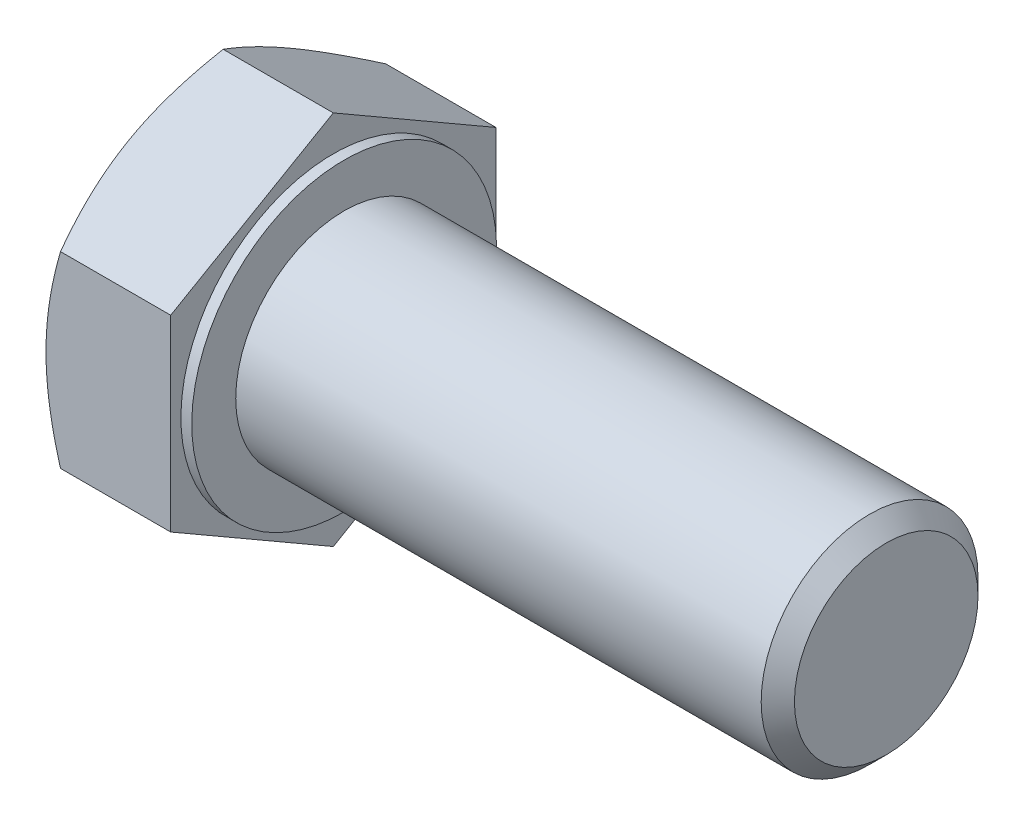
ISO-10303-21;
HEADER;
FILE_DESCRIPTION(('STEP AP214'),'2;1');
FILE_NAME('part.step','',(''),(''),'','','');
FILE_SCHEMA(('AUTOMOTIVE_DESIGN { 1 0 10303 214 1 1 1 1 }'));
ENDSEC;
DATA;
#1=APPLICATION_CONTEXT('core data for automotive mechanical design processes');
#2=APPLICATION_PROTOCOL_DEFINITION('international standard','automotive_design',2000,#1);
#3=PRODUCT_CONTEXT('',#1,'mechanical');
#4=PRODUCT('Part','Part','',(#3));
#5=PRODUCT_RELATED_PRODUCT_CATEGORY('part','',(#4));
#6=PRODUCT_DEFINITION_FORMATION('','',#4);
#7=PRODUCT_DEFINITION_CONTEXT('part definition',#1,'design');
#8=PRODUCT_DEFINITION('design','',#6,#7);
#9=PRODUCT_DEFINITION_SHAPE('','',#8);
#10=(LENGTH_UNIT() NAMED_UNIT(*) SI_UNIT(.MILLI.,.METRE.));
#11=(NAMED_UNIT(*) PLANE_ANGLE_UNIT() SI_UNIT($,.RADIAN.));
#12=(NAMED_UNIT(*) SI_UNIT($,.STERADIAN.) SOLID_ANGLE_UNIT());
#13=UNCERTAINTY_MEASURE_WITH_UNIT(LENGTH_MEASURE(1.E-05),#10,'distance_accuracy_value','');
#14=(GEOMETRIC_REPRESENTATION_CONTEXT(3) GLOBAL_UNCERTAINTY_ASSIGNED_CONTEXT((#13)) GLOBAL_UNIT_ASSIGNED_CONTEXT((#10,
#11,#12)) REPRESENTATION_CONTEXT('',''));
#15=CARTESIAN_POINT('',(0.,0.,0.));
#16=DIRECTION('',(0.,0.,1.));
#17=DIRECTION('',(1.,0.,0.));
#18=AXIS2_PLACEMENT_3D('',#15,#16,#17);
#19=CARTESIAN_POINT('',(0.,9.6225,0.));
#20=DIRECTION('',(1.,0.,0.));
#21=DIRECTION('',(0.,1.,0.));
#22=AXIS2_PLACEMENT_3D('',#19,#20,#21);
#23=PLANE('',#22);
#24=CARTESIAN_POINT('',(0.,0.,0.));
#25=DIRECTION('',(1.,0.,0.));
#26=DIRECTION('',(0.,1.,0.));
#27=AXIS2_PLACEMENT_3D('',#24,#25,#26);
#28=CIRCLE('',#27,8.);
#29=CARTESIAN_POINT('',(0.,-8.,0.));
#30=VERTEX_POINT('',#29);
#31=EDGE_CURVE('E190',#30,#30,#28,.T.);
#32=ORIENTED_EDGE('',*,*,#31,.F.);
#33=EDGE_LOOP('',(#32));
#34=FACE_BOUND('',#33,.T.);
#35=CARTESIAN_POINT('',(0.,0.,0.));
#36=DIRECTION('',(1.,0.,0.));
#37=DIRECTION('',(0.,1.,0.));
#38=AXIS2_PLACEMENT_3D('',#35,#36,#37);
#39=CIRCLE('',#38,11.245);
#40=CARTESIAN_POINT('',(0.,-11.245,0.));
#41=VERTEX_POINT('',#40);
#42=EDGE_CURVE('E21',#41,#41,#39,.T.);
#43=ORIENTED_EDGE('',*,*,#42,.T.);
#44=EDGE_LOOP('',(#43));
#45=FACE_BOUND('',#44,.T.);
#46=ADVANCED_FACE('F17',(#34,#45),#23,.T.);
#47=CARTESIAN_POINT('',(-0.40005,0.,0.));
#48=DIRECTION('',(1.,0.,0.));
#49=DIRECTION('',(0.,1.,0.));
#50=AXIS2_PLACEMENT_3D('',#47,#48,#49);
#51=CYLINDRICAL_SURFACE('',#50,11.245);
#52=ORIENTED_EDGE('',*,*,#42,.F.);
#53=DIRECTION('',(-1.,0.,0.));
#54=VECTOR('',#53,1.);
#55=CARTESIAN_POINT('',(-0.40005,-11.245,0.));
#56=LINE('',#55,#54);
#57=CARTESIAN_POINT('',(-0.8001,-11.245,0.));
#58=VERTEX_POINT('',#57);
#59=EDGE_CURVE('E11',#41,#58,#56,.T.);
#60=ORIENTED_EDGE('',*,*,#59,.T.);
#61=CARTESIAN_POINT('',(-0.8001,0.,0.));
#62=DIRECTION('',(1.,0.,0.));
#63=DIRECTION('',(0.,1.,0.));
#64=AXIS2_PLACEMENT_3D('',#61,#62,#63);
#65=CIRCLE('',#64,11.245);
#66=EDGE_CURVE('E336',#58,#58,#65,.T.);
#67=ORIENTED_EDGE('',*,*,#66,.T.);
#68=ORIENTED_EDGE('',*,*,#59,.F.);
#69=EDGE_LOOP('',(#52,#60,#67,#68));
#70=FACE_BOUND('',#69,.T.);
#71=ADVANCED_FACE('F360',(#70),#51,.T.);
#72=CARTESIAN_POINT('',(-10.0001,0.,0.));
#73=DIRECTION('',(1.,0.,0.));
#74=DIRECTION('',(0.,1.,0.));
#75=AXIS2_PLACEMENT_3D('',#72,#73,#74);
#76=PLANE('',#75);
#77=CARTESIAN_POINT('',(-10.0001,0.,0.));
#78=DIRECTION('',(-1.,0.,0.));
#79=DIRECTION('',(0.,1.,0.));
#80=AXIS2_PLACEMENT_3D('',#77,#78,#79);
#81=CIRCLE('',#80,12.);
#82=CARTESIAN_POINT('',(-10.0001,0.,12.));
#83=VERTEX_POINT('',#82);
#84=CARTESIAN_POINT('',(-10.0001,10.3923048454133,6.));
#85=VERTEX_POINT('',#84);
#86=EDGE_CURVE('E176',#83,#85,#81,.T.);
#87=ORIENTED_EDGE('',*,*,#86,.T.);
#88=CARTESIAN_POINT('',(-10.0001,0.,0.));
#89=DIRECTION('',(-1.,0.,0.));
#90=DIRECTION('',(0.,1.,0.));
#91=AXIS2_PLACEMENT_3D('',#88,#89,#90);
#92=CIRCLE('',#91,12.);
#93=CARTESIAN_POINT('',(-10.0001,10.3923048454133,-6.));
#94=VERTEX_POINT('',#93);
#95=EDGE_CURVE('E165',#85,#94,#92,.T.);
#96=ORIENTED_EDGE('',*,*,#95,.T.);
#97=CARTESIAN_POINT('',(-10.0001,0.,0.));
#98=DIRECTION('',(-1.,0.,0.));
#99=DIRECTION('',(0.,1.,0.));
#100=AXIS2_PLACEMENT_3D('',#97,#98,#99);
#101=CIRCLE('',#100,12.);
#102=CARTESIAN_POINT('',(-10.0001,0.,-12.));
#103=VERTEX_POINT('',#102);
#104=EDGE_CURVE('E262',#94,#103,#101,.T.);
#105=ORIENTED_EDGE('',*,*,#104,.T.);
#106=CARTESIAN_POINT('',(-10.0001,0.,0.));
#107=DIRECTION('',(-1.,0.,0.));
#108=DIRECTION('',(0.,1.,0.));
#109=AXIS2_PLACEMENT_3D('',#106,#107,#108);
#110=CIRCLE('',#109,12.);
#111=CARTESIAN_POINT('',(-10.0001,-10.3923048454133,-6.));
#112=VERTEX_POINT('',#111);
#113=EDGE_CURVE('E226',#103,#112,#110,.T.);
#114=ORIENTED_EDGE('',*,*,#113,.T.);
#115=CARTESIAN_POINT('',(-10.0001,0.,0.));
#116=DIRECTION('',(-1.,0.,0.));
#117=DIRECTION('',(0.,1.,0.));
#118=AXIS2_PLACEMENT_3D('',#115,#116,#117);
#119=CIRCLE('',#118,12.);
#120=CARTESIAN_POINT('',(-10.0001,-10.3923048454133,6.));
#121=VERTEX_POINT('',#120);
#122=EDGE_CURVE('E218',#112,#121,#119,.T.);
#123=ORIENTED_EDGE('',*,*,#122,.T.);
#124=CARTESIAN_POINT('',(-10.0001,0.,0.));
#125=DIRECTION('',(-1.,0.,0.));
#126=DIRECTION('',(0.,1.,0.));
#127=AXIS2_PLACEMENT_3D('',#124,#125,#126);
#128=CIRCLE('',#127,12.);
#129=EDGE_CURVE('E180',#121,#83,#128,.T.);
#130=ORIENTED_EDGE('',*,*,#129,.T.);
#131=EDGE_LOOP('',(#87,#96,#105,#114,#123,#130));
#132=FACE_BOUND('',#131,.T.);
#133=ADVANCED_FACE('F177',(#132),#76,.F.);
#134=CARTESIAN_POINT('',(-0.8001,-13.856406460551,0.));
#135=DIRECTION('',(0.,-0.866025403784439,-0.5));
#136=DIRECTION('',(0.,0.5,-0.866025403784439));
#137=AXIS2_PLACEMENT_3D('',#134,#135,#136);
#138=PLANE('',#137);
#139=CARTESIAN_POINT('',(-10.0001,-10.3923048454133,-6.));
#140=CARTESIAN_POINT('',(-10.0001,-8.78460969082654,-8.78460969082651));
#141=CARTESIAN_POINT('',(-8.92830323027553,-6.92820323027552,-12.));
#142=(BOUNDED_CURVE() B_SPLINE_CURVE(2,(#139,#140,#141),.UNSPECIFIED.,.F.,
.F.) B_SPLINE_CURVE_WITH_KNOTS((3,3),(0.702851662530288,1.40570332506058),
.UNSPECIFIED.) CURVE() GEOMETRIC_REPRESENTATION_ITEM() RATIONAL_B_SPLINE_CURVE((1.,
1.03795484930205,1.)) REPRESENTATION_ITEM(''));
#143=CARTESIAN_POINT('',(-8.92830323027553,-6.92820323027552,-12.));
#144=VERTEX_POINT('',#143);
#145=EDGE_CURVE('E229',#112,#144,#142,.T.);
#146=ORIENTED_EDGE('',*,*,#145,.T.);
#147=DIRECTION('',(-1.,0.,0.));
#148=VECTOR('',#147,1.);
#149=CARTESIAN_POINT('',(-0.8001,-6.9282032302755,-12.));
#150=LINE('',#149,#148);
#151=CARTESIAN_POINT('',(-0.8001,-6.9282032302755,-12.));
#152=VERTEX_POINT('',#151);
#153=EDGE_CURVE('E91',#152,#144,#150,.T.);
#154=ORIENTED_EDGE('',*,*,#153,.F.);
#155=DIRECTION('',(0.,0.5,-0.866025403784439));
#156=VECTOR('',#155,1.);
#157=CARTESIAN_POINT('',(-0.8001,-13.856406460551,0.));
#158=LINE('',#157,#156);
#159=CARTESIAN_POINT('',(-0.8001,-13.856406460551,0.));
#160=VERTEX_POINT('',#159);
#161=EDGE_CURVE('E134',#160,#152,#158,.T.);
#162=ORIENTED_EDGE('',*,*,#161,.F.);
#163=DIRECTION('',(-1.,0.,0.));
#164=VECTOR('',#163,1.);
#165=CARTESIAN_POINT('',(-0.8001,-13.856406460551,0.));
#166=LINE('',#165,#164);
#167=CARTESIAN_POINT('',(-8.92830323027553,-13.856406460551,0.));
#168=VERTEX_POINT('',#167);
#169=EDGE_CURVE('E201',#160,#168,#166,.T.);
#170=ORIENTED_EDGE('',*,*,#169,.T.);
#171=CARTESIAN_POINT('',(-8.92830323027554,-13.856406460551,0.));
#172=CARTESIAN_POINT('',(-10.0001,-12.,-3.21539030917348));
#173=CARTESIAN_POINT('',(-10.0001,-10.3923048454133,-6.));
#174=(BOUNDED_CURVE() B_SPLINE_CURVE(2,(#171,#172,#173),.UNSPECIFIED.,.F.,
.F.) B_SPLINE_CURVE_WITH_KNOTS((3,3),(0.,0.702851662530288),
.UNSPECIFIED.) CURVE() GEOMETRIC_REPRESENTATION_ITEM() RATIONAL_B_SPLINE_CURVE((1.,
1.03795484930205,1.)) REPRESENTATION_ITEM(''));
#175=EDGE_CURVE('E164',#168,#112,#174,.T.);
#176=ORIENTED_EDGE('',*,*,#175,.T.);
#177=EDGE_LOOP('',(#146,#154,#162,#170,#176));
#178=FACE_BOUND('',#177,.T.);
#179=ADVANCED_FACE('F392',(#178),#138,.T.);
#180=CARTESIAN_POINT('',(-0.8001,-6.92820323027551,12.));
#181=DIRECTION('',(0.,-0.866025403784439,0.5));
#182=DIRECTION('',(-1.,0.,0.));
#183=AXIS2_PLACEMENT_3D('',#180,#181,#182);
#184=PLANE('',#183);
#185=CARTESIAN_POINT('',(-10.0001,-10.3923048454133,6.));
#186=CARTESIAN_POINT('',(-10.0001,-12.,3.21539030917348));
#187=CARTESIAN_POINT('',(-8.92830323027553,-13.856406460551,0.));
#188=(BOUNDED_CURVE() B_SPLINE_CURVE(2,(#185,#186,#187),.UNSPECIFIED.,.F.,
.F.) B_SPLINE_CURVE_WITH_KNOTS((3,3),(0.702851662530287,1.40570332506057),
.UNSPECIFIED.) CURVE() GEOMETRIC_REPRESENTATION_ITEM() RATIONAL_B_SPLINE_CURVE((1.,
1.03795484930206,1.)) REPRESENTATION_ITEM(''));
#189=EDGE_CURVE('E225',#121,#168,#188,.T.);
#190=ORIENTED_EDGE('',*,*,#189,.T.);
#191=ORIENTED_EDGE('',*,*,#169,.F.);
#192=DIRECTION('',(0.,-0.5,-0.866025403784439));
#193=VECTOR('',#192,1.);
#194=CARTESIAN_POINT('',(-0.8001,-6.92820323027551,12.));
#195=LINE('',#194,#193);
#196=CARTESIAN_POINT('',(-0.8001,-6.92820323027551,12.));
#197=VERTEX_POINT('',#196);
#198=EDGE_CURVE('E322',#197,#160,#195,.T.);
#199=ORIENTED_EDGE('',*,*,#198,.F.);
#200=DIRECTION('',(-1.,0.,0.));
#201=VECTOR('',#200,1.);
#202=CARTESIAN_POINT('',(-0.8001,-6.92820323027551,12.));
#203=LINE('',#202,#201);
#204=CARTESIAN_POINT('',(-8.92830323027553,-6.92820323027548,12.));
#205=VERTEX_POINT('',#204);
#206=EDGE_CURVE('E333',#197,#205,#203,.T.);
#207=ORIENTED_EDGE('',*,*,#206,.T.);
#208=CARTESIAN_POINT('',(-8.92830323027553,-6.92820323027554,12.));
#209=CARTESIAN_POINT('',(-10.0001,-8.78460969082653,8.78460969082652));
#210=CARTESIAN_POINT('',(-10.0001,-10.3923048454133,6.));
#211=(BOUNDED_CURVE() B_SPLINE_CURVE(2,(#208,#209,#210),.UNSPECIFIED.,.F.,
.F.) B_SPLINE_CURVE_WITH_KNOTS((3,3),(0.,0.702851662530287),
.UNSPECIFIED.) CURVE() GEOMETRIC_REPRESENTATION_ITEM() RATIONAL_B_SPLINE_CURVE((1.,
1.03795484930205,1.)) REPRESENTATION_ITEM(''));
#212=EDGE_CURVE('E217',#205,#121,#211,.T.);
#213=ORIENTED_EDGE('',*,*,#212,.T.);
#214=EDGE_LOOP('',(#190,#191,#199,#207,#213));
#215=FACE_BOUND('',#214,.T.);
#216=ADVANCED_FACE('F388',(#215),#184,.T.);
#217=CARTESIAN_POINT('',(-0.8001,6.9282032302755,12.));
#218=DIRECTION('',(0.,0.,1.));
#219=DIRECTION('',(1.,0.,0.));
#220=AXIS2_PLACEMENT_3D('',#217,#218,#219);
#221=PLANE('',#220);
#222=CARTESIAN_POINT('',(-10.0001,0.,12.));
#223=CARTESIAN_POINT('',(-10.0001,-3.21539030917347,12.));
#224=CARTESIAN_POINT('',(-8.92830323027553,-6.92820323027548,12.));
#225=(BOUNDED_CURVE() B_SPLINE_CURVE(2,(#222,#223,#224),.UNSPECIFIED.,.F.,
.F.) B_SPLINE_CURVE_WITH_KNOTS((3,3),(0.702851662530288,1.40570332506058),
.UNSPECIFIED.) CURVE() GEOMETRIC_REPRESENTATION_ITEM() RATIONAL_B_SPLINE_CURVE((1.,
1.03795484930205,1.)) REPRESENTATION_ITEM(''));
#226=EDGE_CURVE('E232',#83,#205,#225,.T.);
#227=ORIENTED_EDGE('',*,*,#226,.T.);
#228=ORIENTED_EDGE('',*,*,#206,.F.);
#229=DIRECTION('',(0.,-1.,0.));
#230=VECTOR('',#229,1.);
#231=CARTESIAN_POINT('',(-0.8001,6.9282032302755,12.));
#232=LINE('',#231,#230);
#233=CARTESIAN_POINT('',(-0.8001,6.9282032302755,12.));
#234=VERTEX_POINT('',#233);
#235=EDGE_CURVE('E307',#234,#197,#232,.T.);
#236=ORIENTED_EDGE('',*,*,#235,.F.);
#237=DIRECTION('',(-1.,0.,0.));
#238=VECTOR('',#237,1.);
#239=CARTESIAN_POINT('',(-0.8001,6.9282032302755,12.));
#240=LINE('',#239,#238);
#241=CARTESIAN_POINT('',(-8.92830323027553,6.92820323027546,12.));
#242=VERTEX_POINT('',#241);
#243=EDGE_CURVE('E304',#234,#242,#240,.T.);
#244=ORIENTED_EDGE('',*,*,#243,.T.);
#245=CARTESIAN_POINT('',(-8.92830323027554,6.92820323027546,12.));
#246=CARTESIAN_POINT('',(-10.0001,3.21539030917344,12.));
#247=CARTESIAN_POINT('',(-10.0001,0.,12.));
#248=(BOUNDED_CURVE() B_SPLINE_CURVE(2,(#245,#246,#247),.UNSPECIFIED.,.F.,
.F.) B_SPLINE_CURVE_WITH_KNOTS((3,3),(0.,0.702851662530288),
.UNSPECIFIED.) CURVE() GEOMETRIC_REPRESENTATION_ITEM() RATIONAL_B_SPLINE_CURVE((1.,
1.03795484930203,1.)) REPRESENTATION_ITEM(''));
#249=EDGE_CURVE('E185',#242,#83,#248,.T.);
#250=ORIENTED_EDGE('',*,*,#249,.T.);
#251=EDGE_LOOP('',(#227,#228,#236,#244,#250));
#252=FACE_BOUND('',#251,.T.);
#253=ADVANCED_FACE('F385',(#252),#221,.T.);
#254=CARTESIAN_POINT('',(-0.8001,0.,0.));
#255=DIRECTION('',(1.,0.,0.));
#256=DIRECTION('',(0.,1.,0.));
#257=AXIS2_PLACEMENT_3D('',#254,#255,#256);
#258=PLANE('',#257);
#259=ORIENTED_EDGE('',*,*,#66,.F.);
#260=EDGE_LOOP('',(#259));
#261=FACE_BOUND('',#260,.T.);
#262=DIRECTION('',(0.,-0.5,0.866025403784438));
#263=VECTOR('',#262,1.);
#264=CARTESIAN_POINT('',(-0.8001,13.856406460551,0.));
#265=LINE('',#264,#263);
#266=CARTESIAN_POINT('',(-0.8001,13.856406460551,0.));
#267=VERTEX_POINT('',#266);
#268=EDGE_CURVE('E124',#267,#234,#265,.T.);
#269=ORIENTED_EDGE('',*,*,#268,.T.);
#270=ORIENTED_EDGE('',*,*,#235,.T.);
#271=ORIENTED_EDGE('',*,*,#198,.T.);
#272=ORIENTED_EDGE('',*,*,#161,.T.);
#273=DIRECTION('',(0.,1.,0.));
#274=VECTOR('',#273,1.);
#275=CARTESIAN_POINT('',(-0.8001,-6.9282032302755,-12.));
#276=LINE('',#275,#274);
#277=CARTESIAN_POINT('',(-0.8001,6.92820323027551,-12.));
#278=VERTEX_POINT('',#277);
#279=EDGE_CURVE('E263',#152,#278,#276,.T.);
#280=ORIENTED_EDGE('',*,*,#279,.T.);
#281=DIRECTION('',(0.,0.5,0.866025403784439));
#282=VECTOR('',#281,1.);
#283=CARTESIAN_POINT('',(-0.8001,6.92820323027551,-12.));
#284=LINE('',#283,#282);
#285=EDGE_CURVE('E293',#278,#267,#284,.T.);
#286=ORIENTED_EDGE('',*,*,#285,.T.);
#287=EDGE_LOOP('',(#269,#270,#271,#272,#280,#286));
#288=FACE_BOUND('',#287,.T.);
#289=ADVANCED_FACE('F19',(#261,#288),#258,.T.);
#290=CARTESIAN_POINT('',(-0.8001,13.856406460551,0.));
#291=DIRECTION('',(0.,0.866025403784438,0.5));
#292=DIRECTION('',(1.,0.,0.));
#293=AXIS2_PLACEMENT_3D('',#290,#291,#292);
#294=PLANE('',#293);
#295=CARTESIAN_POINT('',(-8.92830323027554,13.856406460551,0.));
#296=CARTESIAN_POINT('',(-10.0001,12.,3.21539030917351));
#297=CARTESIAN_POINT('',(-10.0001,10.3923048454133,6.));
#298=(BOUNDED_CURVE() B_SPLINE_CURVE(2,(#295,#296,#297),.UNSPECIFIED.,.F.,
.F.) B_SPLINE_CURVE_WITH_KNOTS((3,3),(0.,0.702851662530288),
.UNSPECIFIED.) CURVE() GEOMETRIC_REPRESENTATION_ITEM() RATIONAL_B_SPLINE_CURVE((1.,
1.03795484930205,1.)) REPRESENTATION_ITEM(''));
#299=CARTESIAN_POINT('',(-8.92830323027553,13.856406460551,0.));
#300=VERTEX_POINT('',#299);
#301=EDGE_CURVE('E153',#300,#85,#298,.T.);
#302=ORIENTED_EDGE('',*,*,#301,.T.);
#303=CARTESIAN_POINT('',(-10.0001,10.3923048454133,6.));
#304=CARTESIAN_POINT('',(-10.0001,8.78460969082653,8.78460969082649));
#305=CARTESIAN_POINT('',(-8.92830323027554,6.92820323027551,12.));
#306=(BOUNDED_CURVE() B_SPLINE_CURVE(2,(#303,#304,#305),.UNSPECIFIED.,.F.,
.F.) B_SPLINE_CURVE_WITH_KNOTS((3,3),(0.702851662530288,1.40570332506058),
.UNSPECIFIED.) CURVE() GEOMETRIC_REPRESENTATION_ITEM() RATIONAL_B_SPLINE_CURVE((1.,
1.03795484930204,1.)) REPRESENTATION_ITEM(''));
#307=EDGE_CURVE('E157',#85,#242,#306,.T.);
#308=ORIENTED_EDGE('',*,*,#307,.T.);
#309=ORIENTED_EDGE('',*,*,#243,.F.);
#310=ORIENTED_EDGE('',*,*,#268,.F.);
#311=DIRECTION('',(-1.,0.,0.));
#312=VECTOR('',#311,1.);
#313=CARTESIAN_POINT('',(-0.8001,13.856406460551,0.));
#314=LINE('',#313,#312);
#315=EDGE_CURVE('E159',#267,#300,#314,.T.);
#316=ORIENTED_EDGE('',*,*,#315,.T.);
#317=EDGE_LOOP('',(#302,#308,#309,#310,#316));
#318=FACE_BOUND('',#317,.T.);
#319=ADVANCED_FACE('F155',(#318),#294,.T.);
#320=CARTESIAN_POINT('',(-0.8001,6.92820323027551,-12.));
#321=DIRECTION('',(0.,0.866025403784439,-0.5));
#322=DIRECTION('',(-1.,0.,0.));
#323=AXIS2_PLACEMENT_3D('',#320,#321,#322);
#324=PLANE('',#323);
#325=CARTESIAN_POINT('',(-8.92830323027553,6.92820323027552,-12.));
#326=CARTESIAN_POINT('',(-10.0001,8.78460969082652,-8.78460969082651));
#327=CARTESIAN_POINT('',(-10.0001,10.3923048454133,-6.));
#328=(BOUNDED_CURVE() B_SPLINE_CURVE(2,(#325,#326,#327),.UNSPECIFIED.,.F.,
.F.) B_SPLINE_CURVE_WITH_KNOTS((3,3),(0.,0.702851662530289),
.UNSPECIFIED.) CURVE() GEOMETRIC_REPRESENTATION_ITEM() RATIONAL_B_SPLINE_CURVE((1.,
1.03795484930204,1.)) REPRESENTATION_ITEM(''));
#329=CARTESIAN_POINT('',(-8.92830323027553,6.92820323027548,-12.));
#330=VERTEX_POINT('',#329);
#331=EDGE_CURVE('E277',#330,#94,#328,.T.);
#332=ORIENTED_EDGE('',*,*,#331,.T.);
#333=CARTESIAN_POINT('',(-10.0001,10.3923048454133,-6.));
#334=CARTESIAN_POINT('',(-10.0001,12.,-3.21539030917347));
#335=CARTESIAN_POINT('',(-8.92830323027553,13.856406460551,0.));
#336=(BOUNDED_CURVE() B_SPLINE_CURVE(2,(#333,#334,#335),.UNSPECIFIED.,.F.,
.F.) B_SPLINE_CURVE_WITH_KNOTS((3,3),(0.702851662530289,1.40570332506058),
.UNSPECIFIED.) CURVE() GEOMETRIC_REPRESENTATION_ITEM() RATIONAL_B_SPLINE_CURVE((1.,
1.03795484930205,1.)) REPRESENTATION_ITEM(''));
#337=EDGE_CURVE('E170',#94,#300,#336,.T.);
#338=ORIENTED_EDGE('',*,*,#337,.T.);
#339=ORIENTED_EDGE('',*,*,#315,.F.);
#340=ORIENTED_EDGE('',*,*,#285,.F.);
#341=DIRECTION('',(-1.,0.,0.));
#342=VECTOR('',#341,1.);
#343=CARTESIAN_POINT('',(-0.8001,6.92820323027551,-12.));
#344=LINE('',#343,#342);
#345=EDGE_CURVE('E102',#278,#330,#344,.T.);
#346=ORIENTED_EDGE('',*,*,#345,.T.);
#347=EDGE_LOOP('',(#332,#338,#339,#340,#346));
#348=FACE_BOUND('',#347,.T.);
#349=ADVANCED_FACE('F381',(#348),#324,.T.);
#350=CARTESIAN_POINT('',(-0.8001,-6.9282032302755,-12.));
#351=DIRECTION('',(0.,0.,-1.));
#352=DIRECTION('',(0.,-1.,0.));
#353=AXIS2_PLACEMENT_3D('',#350,#351,#352);
#354=PLANE('',#353);
#355=CARTESIAN_POINT('',(-8.92830323027553,-6.92820323027547,-12.));
#356=CARTESIAN_POINT('',(-10.0001,-3.21539030917344,-12.));
#357=CARTESIAN_POINT('',(-10.0001,0.,-12.));
#358=(BOUNDED_CURVE() B_SPLINE_CURVE(2,(#355,#356,#357),.UNSPECIFIED.,.F.,
.F.) B_SPLINE_CURVE_WITH_KNOTS((3,3),(0.,0.702851662530288),
.UNSPECIFIED.) CURVE() GEOMETRIC_REPRESENTATION_ITEM() RATIONAL_B_SPLINE_CURVE((1.,
1.03795484930203,1.)) REPRESENTATION_ITEM(''));
#359=EDGE_CURVE('E272',#144,#103,#358,.T.);
#360=ORIENTED_EDGE('',*,*,#359,.T.);
#361=CARTESIAN_POINT('',(-10.0001,0.,-12.));
#362=CARTESIAN_POINT('',(-10.0001,3.21539030917345,-12.));
#363=CARTESIAN_POINT('',(-8.92830323027553,6.92820323027548,-12.));
#364=(BOUNDED_CURVE() B_SPLINE_CURVE(2,(#361,#362,#363),.UNSPECIFIED.,.F.,
.F.) B_SPLINE_CURVE_WITH_KNOTS((3,3),(0.702851662530288,1.40570332506058),
.UNSPECIFIED.) CURVE() GEOMETRIC_REPRESENTATION_ITEM() RATIONAL_B_SPLINE_CURVE((1.,
1.03795484930205,1.)) REPRESENTATION_ITEM(''));
#365=EDGE_CURVE('E224',#103,#330,#364,.T.);
#366=ORIENTED_EDGE('',*,*,#365,.T.);
#367=ORIENTED_EDGE('',*,*,#345,.F.);
#368=ORIENTED_EDGE('',*,*,#279,.F.);
#369=ORIENTED_EDGE('',*,*,#153,.T.);
#370=EDGE_LOOP('',(#360,#366,#367,#368,#369));
#371=FACE_BOUND('',#370,.T.);
#372=ADVANCED_FACE('F384',(#371),#354,.T.);
#373=CARTESIAN_POINT('',(-9.46420161513777,0.,0.));
#374=DIRECTION('',(1.,0.,0.));
#375=DIRECTION('',(0.,1.,0.));
#376=AXIS2_PLACEMENT_3D('',#373,#374,#375);
#377=CONICAL_SURFACE('',#376,12.9282032302755,1.0471975511966);
#378=ORIENTED_EDGE('',*,*,#359,.F.);
#379=ORIENTED_EDGE('',*,*,#145,.F.);
#380=ORIENTED_EDGE('',*,*,#113,.F.);
#381=EDGE_LOOP('',(#378,#379,#380));
#382=FACE_BOUND('',#381,.T.);
#383=ADVANCED_FACE('F399',(#382),#377,.T.);
#384=CARTESIAN_POINT('',(-9.46420161513777,0.,0.));
#385=DIRECTION('',(1.,0.,0.));
#386=DIRECTION('',(0.,1.,0.));
#387=AXIS2_PLACEMENT_3D('',#384,#385,#386);
#388=CONICAL_SURFACE('',#387,12.9282032302755,1.0471975511966);
#389=ORIENTED_EDGE('',*,*,#365,.F.);
#390=ORIENTED_EDGE('',*,*,#104,.F.);
#391=ORIENTED_EDGE('',*,*,#331,.F.);
#392=EDGE_LOOP('',(#389,#390,#391));
#393=FACE_BOUND('',#392,.T.);
#394=ADVANCED_FACE('F376',(#393),#388,.T.);
#395=CARTESIAN_POINT('',(-9.46420161513777,0.,0.));
#396=DIRECTION('',(1.,0.,0.));
#397=DIRECTION('',(0.,-1.,0.));
#398=AXIS2_PLACEMENT_3D('',#395,#396,#397);
#399=CONICAL_SURFACE('',#398,12.9282032302755,1.0471975511966);
#400=ORIENTED_EDGE('',*,*,#175,.F.);
#401=ORIENTED_EDGE('',*,*,#189,.F.);
#402=ORIENTED_EDGE('',*,*,#122,.F.);
#403=EDGE_LOOP('',(#400,#401,#402));
#404=FACE_BOUND('',#403,.T.);
#405=ADVANCED_FACE('F373',(#404),#399,.T.);
#406=CARTESIAN_POINT('',(-9.46420161513777,0.,0.));
#407=DIRECTION('',(1.,0.,0.));
#408=DIRECTION('',(0.,1.,0.));
#409=AXIS2_PLACEMENT_3D('',#406,#407,#408);
#410=CONICAL_SURFACE('',#409,12.9282032302755,1.0471975511966);
#411=ORIENTED_EDGE('',*,*,#337,.F.);
#412=ORIENTED_EDGE('',*,*,#95,.F.);
#413=ORIENTED_EDGE('',*,*,#301,.F.);
#414=EDGE_LOOP('',(#411,#412,#413));
#415=FACE_BOUND('',#414,.T.);
#416=ADVANCED_FACE('F169',(#415),#410,.T.);
#417=CARTESIAN_POINT('',(-9.46420161513777,0.,0.));
#418=DIRECTION('',(1.,0.,0.));
#419=DIRECTION('',(0.,1.,0.));
#420=AXIS2_PLACEMENT_3D('',#417,#418,#419);
#421=CONICAL_SURFACE('',#420,12.9282032302755,1.0471975511966);
#422=ORIENTED_EDGE('',*,*,#212,.F.);
#423=ORIENTED_EDGE('',*,*,#226,.F.);
#424=ORIENTED_EDGE('',*,*,#129,.F.);
#425=EDGE_LOOP('',(#422,#423,#424));
#426=FACE_BOUND('',#425,.T.);
#427=ADVANCED_FACE('F356',(#426),#421,.T.);
#428=CARTESIAN_POINT('',(-9.46420161513777,0.,0.));
#429=DIRECTION('',(1.,0.,0.));
#430=DIRECTION('',(0.,1.,0.));
#431=AXIS2_PLACEMENT_3D('',#428,#429,#430);
#432=CONICAL_SURFACE('',#431,12.9282032302755,1.0471975511966);
#433=ORIENTED_EDGE('',*,*,#307,.F.);
#434=ORIENTED_EDGE('',*,*,#86,.F.);
#435=ORIENTED_EDGE('',*,*,#249,.F.);
#436=EDGE_LOOP('',(#433,#434,#435));
#437=FACE_BOUND('',#436,.T.);
#438=ADVANCED_FACE('F187',(#437),#432,.T.);
#439=CARTESIAN_POINT('',(40.,4.,0.));
#440=DIRECTION('',(1.,0.,0.));
#441=DIRECTION('',(0.,1.,0.));
#442=AXIS2_PLACEMENT_3D('',#439,#440,#441);
#443=PLANE('',#442);
#444=CARTESIAN_POINT('',(40.,0.,0.));
#445=DIRECTION('',(-1.,0.,0.));
#446=DIRECTION('',(0.,-1.,0.));
#447=AXIS2_PLACEMENT_3D('',#444,#445,#446);
#448=CIRCLE('',#447,6.7731);
#449=CARTESIAN_POINT('',(40.,6.7731,0.));
#450=VERTEX_POINT('',#449);
#451=EDGE_CURVE('E211',#450,#450,#448,.T.);
#452=ORIENTED_EDGE('',*,*,#451,.F.);
#453=EDGE_LOOP('',(#452));
#454=FACE_BOUND('',#453,.T.);
#455=ADVANCED_FACE('F346',(#454),#443,.T.);
#456=CARTESIAN_POINT('',(23.,0.,0.));
#457=DIRECTION('',(1.,0.,0.));
#458=DIRECTION('',(0.,1.,0.));
#459=AXIS2_PLACEMENT_3D('',#456,#457,#458);
#460=CYLINDRICAL_SURFACE('',#459,8.);
#461=CARTESIAN_POINT('',(38.773,0.,0.));
#462=DIRECTION('',(1.,0.,0.));
#463=DIRECTION('',(0.,-1.,0.));
#464=AXIS2_PLACEMENT_3D('',#461,#462,#463);
#465=CIRCLE('',#464,8.);
#466=CARTESIAN_POINT('',(38.773,8.,0.));
#467=VERTEX_POINT('',#466);
#468=CARTESIAN_POINT('',(38.773,-8.,0.));
#469=VERTEX_POINT('',#468);
#470=EDGE_CURVE('E290',#467,#469,#465,.T.);
#471=ORIENTED_EDGE('',*,*,#470,.F.);
#472=CARTESIAN_POINT('',(38.773,0.,0.));
#473=DIRECTION('',(1.,0.,0.));
#474=DIRECTION('',(0.,-1.,0.));
#475=AXIS2_PLACEMENT_3D('',#472,#473,#474);
#476=CIRCLE('',#475,8.);
#477=EDGE_CURVE('E212',#469,#467,#476,.T.);
#478=ORIENTED_EDGE('',*,*,#477,.F.);
#479=DIRECTION('',(-1.,0.,0.));
#480=VECTOR('',#479,1.);
#481=CARTESIAN_POINT('',(23.,-8.,0.));
#482=LINE('',#481,#480);
#483=EDGE_CURVE('E196',#469,#30,#482,.T.);
#484=ORIENTED_EDGE('',*,*,#483,.T.);
#485=ORIENTED_EDGE('',*,*,#31,.T.);
#486=ORIENTED_EDGE('',*,*,#483,.F.);
#487=EDGE_LOOP('',(#471,#478,#484,#485,#486));
#488=FACE_BOUND('',#487,.T.);
#489=ADVANCED_FACE('F348',(#488),#460,.T.);
#490=CARTESIAN_POINT('',(39.3865,0.,0.));
#491=DIRECTION('',(-1.,0.,0.));
#492=DIRECTION('',(0.,-1.,0.));
#493=AXIS2_PLACEMENT_3D('',#490,#491,#492);
#494=CONICAL_SURFACE('',#493,7.38655,0.785357411940605);
#495=ORIENTED_EDGE('',*,*,#470,.T.);
#496=ORIENTED_EDGE('',*,*,#477,.T.);
#497=DIRECTION('',(0.707135596230878,-0.707077964967939,0.));
#498=VECTOR('',#497,1.);
#499=CARTESIAN_POINT('',(39.3865,7.38655,0.));
#500=LINE('',#499,#498);
#501=EDGE_CURVE('E207',#467,#450,#500,.T.);
#502=ORIENTED_EDGE('',*,*,#501,.T.);
#503=ORIENTED_EDGE('',*,*,#451,.T.);
#504=ORIENTED_EDGE('',*,*,#501,.F.);
#505=EDGE_LOOP('',(#495,#496,#502,#503,#504));
#506=FACE_BOUND('',#505,.T.);
#507=ADVANCED_FACE('F344',(#506),#494,.T.);
#508=CLOSED_SHELL('',(#46,#71,#133,#179,#216,#253,#289,#319,#349,#372,#383,#394,#405,#416,#427,
#438,#455,#489,#507));
#509=MANIFOLD_SOLID_BREP('B1',#508);
#510=ADVANCED_BREP_SHAPE_REPRESENTATION('',(#18,#509),#14);
#511=SHAPE_DEFINITION_REPRESENTATION(#9,#510);
ENDSEC;
END-ISO-10303-21;
